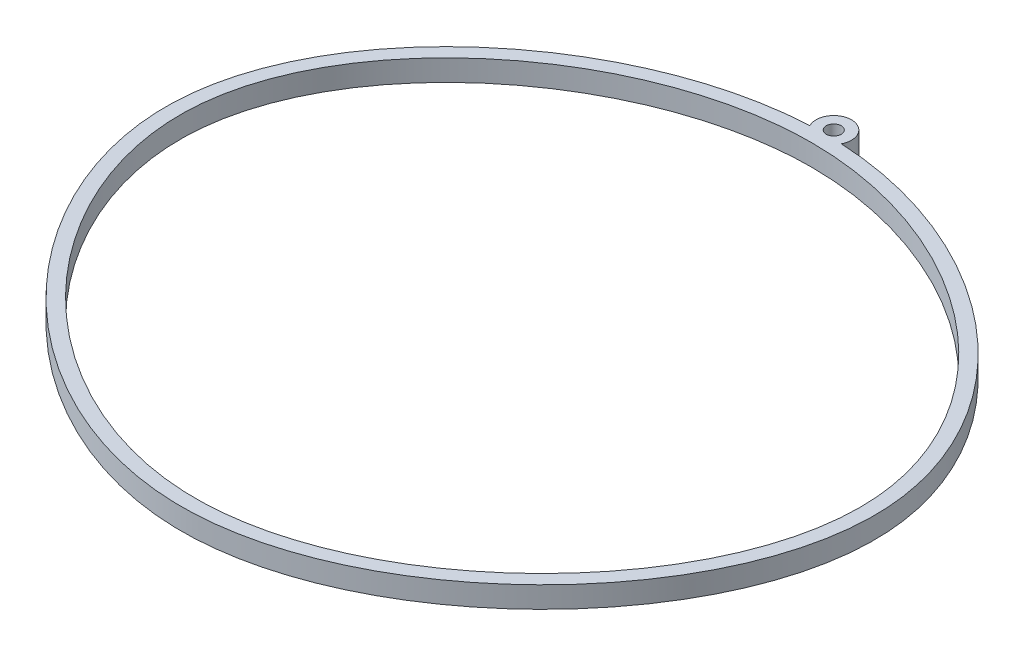
ISO-10303-21;
HEADER;
FILE_DESCRIPTION(('STEP AP214'),'2;1');
FILE_NAME('part.step','',(''),(''),'','','');
FILE_SCHEMA(('AUTOMOTIVE_DESIGN { 1 0 10303 214 1 1 1 1 }'));
ENDSEC;
DATA;
#1=APPLICATION_CONTEXT('core data for automotive mechanical design processes');
#2=APPLICATION_PROTOCOL_DEFINITION('international standard','automotive_design',2000,#1);
#3=PRODUCT_CONTEXT('',#1,'mechanical');
#4=PRODUCT('Part','Part','',(#3));
#5=PRODUCT_RELATED_PRODUCT_CATEGORY('part','',(#4));
#6=PRODUCT_DEFINITION_FORMATION('','',#4);
#7=PRODUCT_DEFINITION_CONTEXT('part definition',#1,'design');
#8=PRODUCT_DEFINITION('design','',#6,#7);
#9=PRODUCT_DEFINITION_SHAPE('','',#8);
#10=(LENGTH_UNIT() NAMED_UNIT(*) SI_UNIT(.MILLI.,.METRE.));
#11=(NAMED_UNIT(*) PLANE_ANGLE_UNIT() SI_UNIT($,.RADIAN.));
#12=(NAMED_UNIT(*) SI_UNIT($,.STERADIAN.) SOLID_ANGLE_UNIT());
#13=UNCERTAINTY_MEASURE_WITH_UNIT(LENGTH_MEASURE(1.E-05),#10,'distance_accuracy_value','');
#14=(GEOMETRIC_REPRESENTATION_CONTEXT(3) GLOBAL_UNCERTAINTY_ASSIGNED_CONTEXT((#13)) GLOBAL_UNIT_ASSIGNED_CONTEXT((#10,
#11,#12)) REPRESENTATION_CONTEXT('',''));
#15=CARTESIAN_POINT('',(0.,0.,0.));
#16=DIRECTION('',(0.,0.,1.));
#17=DIRECTION('',(1.,0.,0.));
#18=AXIS2_PLACEMENT_3D('',#15,#16,#17);
#19=CARTESIAN_POINT('',(0.,3.,-42.187));
#20=DIRECTION('',(0.,-1.,0.));
#21=DIRECTION('',(0.,0.,-1.));
#22=AXIS2_PLACEMENT_3D('',#19,#20,#21);
#23=CYLINDRICAL_SURFACE('',#22,2.49999999999998);
#24=CARTESIAN_POINT('',(0.,0.,-42.187));
#25=DIRECTION('',(0.,1.,0.));
#26=DIRECTION('',(0.,0.,1.));
#27=AXIS2_PLACEMENT_3D('',#24,#25,#26);
#28=CIRCLE('',#27,2.49999999999998);
#29=CARTESIAN_POINT('',(2.21781041122459,0.,-41.0331728986266));
#30=VERTEX_POINT('',#29);
#31=CARTESIAN_POINT('',(-2.21781041122459,0.,-41.0331728986266));
#32=VERTEX_POINT('',#31);
#33=EDGE_CURVE('E62',#30,#32,#28,.T.);
#34=ORIENTED_EDGE('',*,*,#33,.T.);
#35=DIRECTION('',(0.,-1.,0.));
#36=VECTOR('',#35,1.);
#37=CARTESIAN_POINT('',(-2.21781041122459,3.,-41.0331728986266));
#38=LINE('',#37,#36);
#39=CARTESIAN_POINT('',(-2.21781041122459,3.,-41.0331728986266));
#40=VERTEX_POINT('',#39);
#41=EDGE_CURVE('E11',#40,#32,#38,.T.);
#42=ORIENTED_EDGE('',*,*,#41,.F.);
#43=CARTESIAN_POINT('',(0.,3.,-42.187));
#44=DIRECTION('',(0.,1.,0.));
#45=DIRECTION('',(0.,0.,1.));
#46=AXIS2_PLACEMENT_3D('',#43,#44,#45);
#47=CIRCLE('',#46,2.49999999999998);
#48=CARTESIAN_POINT('',(2.21781041122459,3.,-41.0331728986266));
#49=VERTEX_POINT('',#48);
#50=EDGE_CURVE('E64',#49,#40,#47,.T.);
#51=ORIENTED_EDGE('',*,*,#50,.F.);
#52=DIRECTION('',(0.,-1.,0.));
#53=VECTOR('',#52,1.);
#54=CARTESIAN_POINT('',(2.21781041122459,3.,-41.0331728986266));
#55=LINE('',#54,#53);
#56=EDGE_CURVE('E46',#49,#30,#55,.T.);
#57=ORIENTED_EDGE('',*,*,#56,.T.);
#58=EDGE_LOOP('',(#34,#42,#51,#57));
#59=FACE_BOUND('',#58,.T.);
#60=ADVANCED_FACE('F37',(#59),#23,.T.);
#61=CARTESIAN_POINT('',(0.,3.,-41.087));
#62=CARTESIAN_POINT('',(24.2392399917237,3.,-41.087));
#63=CARTESIAN_POINT('',(74.9101888180753,3.,-0.420519159629572));
#64=CARTESIAN_POINT('',(0.,3.,75.9556651077568));
#65=CARTESIAN_POINT('',(-74.9101888180753,3.,-0.420519159629543));
#66=CARTESIAN_POINT('',(-24.2392399917237,3.,-41.087));
#67=CARTESIAN_POINT('',(0.,3.,-41.087));
#68=B_SPLINE_CURVE_WITH_KNOTS('',3,(#61,#62,#63,#64,#65,#66,#67),.UNSPECIFIED.,.T.,.F.,(4,1,1,1,
4),(0.,0.239182811385584,0.5,0.760817188614416,1.),.UNSPECIFIED.);
#69=DIRECTION('',(0.,-1.,0.));
#70=VECTOR('',#69,1.);
#71=SURFACE_OF_LINEAR_EXTRUSION('',#68,#70);
#72=CARTESIAN_POINT('',(0.,0.,-41.087));
#73=CARTESIAN_POINT('',(24.2392399917237,0.,-41.087));
#74=CARTESIAN_POINT('',(74.9101888180753,0.,-0.420519159629572));
#75=CARTESIAN_POINT('',(0.,0.,75.9556651077568));
#76=CARTESIAN_POINT('',(-74.9101888180753,0.,-0.420519159629543));
#77=CARTESIAN_POINT('',(-24.2392399917237,0.,-41.087));
#78=CARTESIAN_POINT('',(0.,0.,-41.087));
#79=B_SPLINE_CURVE_WITH_KNOTS('',3,(#72,#73,#74,#75,#76,#77,#78),.UNSPECIFIED.,.T.,.F.,(4,1,1,1,
4),(0.,0.239182811385584,0.5,0.760817188614416,1.),.UNSPECIFIED.);
#80=EDGE_CURVE('E70',#30,#32,#79,.T.);
#81=ORIENTED_EDGE('',*,*,#80,.F.);
#82=ORIENTED_EDGE('',*,*,#56,.F.);
#83=EDGE_CURVE('E97',#49,#40,#68,.T.);
#84=ORIENTED_EDGE('',*,*,#83,.T.);
#85=ORIENTED_EDGE('',*,*,#41,.T.);
#86=EDGE_LOOP('',(#81,#82,#84,#85));
#87=FACE_BOUND('',#86,.T.);
#88=ADVANCED_FACE('F73',(#87),#71,.T.);
#89=CARTESIAN_POINT('',(0.,3.,-42.187));
#90=DIRECTION('',(0.,-1.,0.));
#91=DIRECTION('',(0.,0.,-1.));
#92=AXIS2_PLACEMENT_3D('',#89,#90,#91);
#93=CYLINDRICAL_SURFACE('',#92,1.05);
#94=CARTESIAN_POINT('',(0.,3.,-42.187));
#95=DIRECTION('',(0.,1.,0.));
#96=DIRECTION('',(0.,0.,1.));
#97=AXIS2_PLACEMENT_3D('',#94,#95,#96);
#98=CIRCLE('',#97,1.05);
#99=CARTESIAN_POINT('',(0.,3.,-41.137));
#100=VERTEX_POINT('',#99);
#101=EDGE_CURVE('E77',#100,#100,#98,.T.);
#102=ORIENTED_EDGE('',*,*,#101,.T.);
#103=EDGE_LOOP('',(#102));
#104=FACE_BOUND('',#103,.T.);
#105=CARTESIAN_POINT('',(0.,0.,-42.187));
#106=DIRECTION('',(0.,1.,0.));
#107=DIRECTION('',(0.,0.,1.));
#108=AXIS2_PLACEMENT_3D('',#105,#106,#107);
#109=CIRCLE('',#108,1.05);
#110=CARTESIAN_POINT('',(0.,0.,-41.137));
#111=VERTEX_POINT('',#110);
#112=EDGE_CURVE('E71',#111,#111,#109,.T.);
#113=ORIENTED_EDGE('',*,*,#112,.F.);
#114=EDGE_LOOP('',(#113));
#115=FACE_BOUND('',#114,.T.);
#116=ADVANCED_FACE('F39',(#104,#115),#93,.F.);
#117=CARTESIAN_POINT('',(0.,3.,-39.087));
#118=CARTESIAN_POINT('',(23.2408264667178,3.,-39.087));
#119=CARTESIAN_POINT('',(71.9152647894352,3.,-0.439659970544512));
#120=CARTESIAN_POINT('',(0.,3.,72.9653211133145));
#121=CARTESIAN_POINT('',(-71.9152647894352,3.,-0.439659970544512));
#122=CARTESIAN_POINT('',(-23.2408264667178,3.,-39.087));
#123=CARTESIAN_POINT('',(0.,3.,-39.087));
#124=B_SPLINE_CURVE_WITH_KNOTS('',3,(#117,#118,#119,#120,#121,#122,#123),.UNSPECIFIED.,.T.,.F.,
(4,1,1,1,4),(0.,0.238737490021234,0.5,0.761262509978766,1.),.UNSPECIFIED.);
#125=DIRECTION('',(0.,-1.,0.));
#126=VECTOR('',#125,1.);
#127=SURFACE_OF_LINEAR_EXTRUSION('',#124,#126);
#128=CARTESIAN_POINT('',(0.,3.,-39.087));
#129=VERTEX_POINT('',#128);
#130=EDGE_CURVE('E66',#129,#129,#124,.T.);
#131=ORIENTED_EDGE('',*,*,#130,.F.);
#132=EDGE_LOOP('',(#131));
#133=FACE_BOUND('',#132,.T.);
#134=CARTESIAN_POINT('',(0.,0.,-39.087));
#135=CARTESIAN_POINT('',(23.2408264667178,0.,-39.087));
#136=CARTESIAN_POINT('',(71.9152647894352,0.,-0.439659970544512));
#137=CARTESIAN_POINT('',(0.,0.,72.9653211133145));
#138=CARTESIAN_POINT('',(-71.9152647894352,0.,-0.439659970544512));
#139=CARTESIAN_POINT('',(-23.2408264667178,0.,-39.087));
#140=CARTESIAN_POINT('',(0.,0.,-39.087));
#141=B_SPLINE_CURVE_WITH_KNOTS('',3,(#134,#135,#136,#137,#138,#139,#140),.UNSPECIFIED.,.T.,.F.,
(4,1,1,1,4),(0.,0.238737490021234,0.5,0.761262509978766,1.),.UNSPECIFIED.);
#142=CARTESIAN_POINT('',(0.,0.,-39.087));
#143=VERTEX_POINT('',#142);
#144=EDGE_CURVE('E74',#143,#143,#141,.T.);
#145=ORIENTED_EDGE('',*,*,#144,.T.);
#146=EDGE_LOOP('',(#145));
#147=FACE_BOUND('',#146,.T.);
#148=ADVANCED_FACE('F106',(#133,#147),#127,.F.);
#149=CARTESIAN_POINT('',(0.,3.,0.));
#150=DIRECTION('',(0.,1.,0.));
#151=DIRECTION('',(0.,0.,1.));
#152=AXIS2_PLACEMENT_3D('',#149,#150,#151);
#153=PLANE('',#152);
#154=ORIENTED_EDGE('',*,*,#101,.F.);
#155=EDGE_LOOP('',(#154));
#156=FACE_BOUND('',#155,.T.);
#157=ORIENTED_EDGE('',*,*,#50,.T.);
#158=ORIENTED_EDGE('',*,*,#83,.F.);
#159=EDGE_LOOP('',(#157,#158));
#160=FACE_BOUND('',#159,.T.);
#161=ORIENTED_EDGE('',*,*,#130,.T.);
#162=EDGE_LOOP('',(#161));
#163=FACE_BOUND('',#162,.T.);
#164=ADVANCED_FACE('F110',(#156,#160,#163),#153,.T.);
#165=CARTESIAN_POINT('',(0.,0.,0.));
#166=DIRECTION('',(0.,1.,0.));
#167=DIRECTION('',(0.,0.,1.));
#168=AXIS2_PLACEMENT_3D('',#165,#166,#167);
#169=PLANE('',#168);
#170=ORIENTED_EDGE('',*,*,#112,.T.);
#171=EDGE_LOOP('',(#170));
#172=FACE_BOUND('',#171,.T.);
#173=ORIENTED_EDGE('',*,*,#33,.F.);
#174=ORIENTED_EDGE('',*,*,#80,.T.);
#175=EDGE_LOOP('',(#173,#174));
#176=FACE_BOUND('',#175,.T.);
#177=ORIENTED_EDGE('',*,*,#144,.F.);
#178=EDGE_LOOP('',(#177));
#179=FACE_BOUND('',#178,.T.);
#180=ADVANCED_FACE('F68',(#172,#176,#179),#169,.F.);
#181=CLOSED_SHELL('',(#60,#88,#116,#148,#164,#180));
#182=MANIFOLD_SOLID_BREP('B2',#181);
#183=ADVANCED_BREP_SHAPE_REPRESENTATION('',(#18,#182),#14);
#184=SHAPE_DEFINITION_REPRESENTATION(#9,#183);
ENDSEC;
END-ISO-10303-21;
